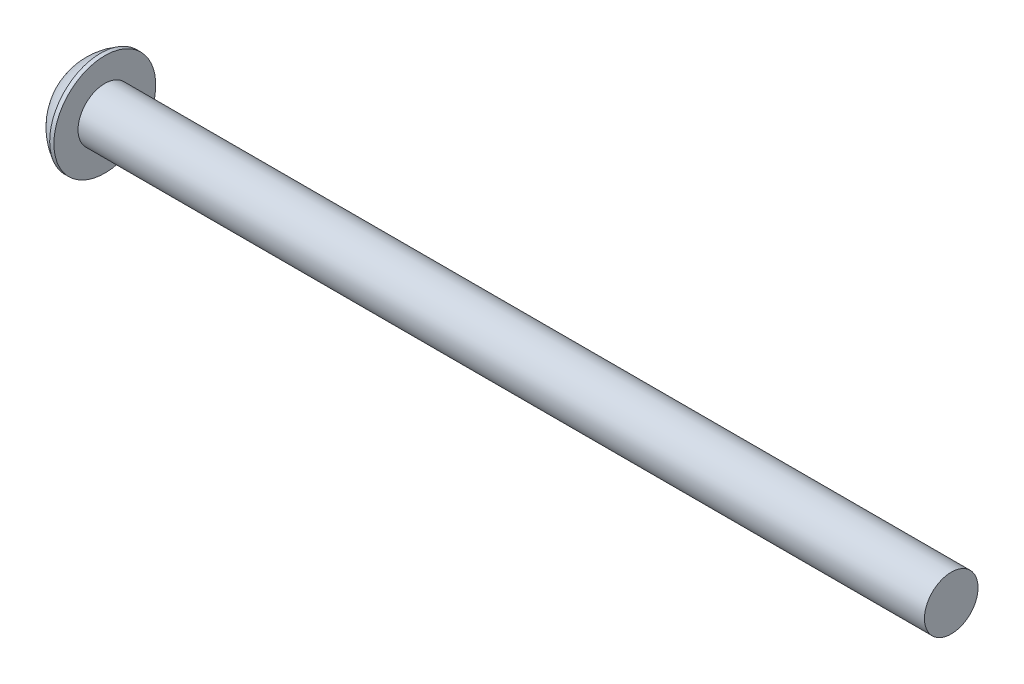
ISO-10303-21;
HEADER;
FILE_DESCRIPTION(('STEP AP214'),'2;1');
FILE_NAME('part.step','',(''),(''),'','','');
FILE_SCHEMA(('AUTOMOTIVE_DESIGN { 1 0 10303 214 1 1 1 1 }'));
ENDSEC;
DATA;
#1=APPLICATION_CONTEXT('core data for automotive mechanical design processes');
#2=APPLICATION_PROTOCOL_DEFINITION('international standard','automotive_design',2000,#1);
#3=PRODUCT_CONTEXT('',#1,'mechanical');
#4=PRODUCT('Part','Part','',(#3));
#5=PRODUCT_RELATED_PRODUCT_CATEGORY('part','',(#4));
#6=PRODUCT_DEFINITION_FORMATION('','',#4);
#7=PRODUCT_DEFINITION_CONTEXT('part definition',#1,'design');
#8=PRODUCT_DEFINITION('design','',#6,#7);
#9=PRODUCT_DEFINITION_SHAPE('','',#8);
#10=(LENGTH_UNIT() NAMED_UNIT(*) SI_UNIT(.MILLI.,.METRE.));
#11=(NAMED_UNIT(*) PLANE_ANGLE_UNIT() SI_UNIT($,.RADIAN.));
#12=(NAMED_UNIT(*) SI_UNIT($,.STERADIAN.) SOLID_ANGLE_UNIT());
#13=UNCERTAINTY_MEASURE_WITH_UNIT(LENGTH_MEASURE(1.E-05),#10,'distance_accuracy_value','');
#14=(GEOMETRIC_REPRESENTATION_CONTEXT(3) GLOBAL_UNCERTAINTY_ASSIGNED_CONTEXT((#13)) GLOBAL_UNIT_ASSIGNED_CONTEXT((#10,
#11,#12)) REPRESENTATION_CONTEXT('',''));
#15=CARTESIAN_POINT('',(0.,0.,0.));
#16=DIRECTION('',(0.,0.,1.));
#17=DIRECTION('',(1.,0.,0.));
#18=AXIS2_PLACEMENT_3D('',#15,#16,#17);
#19=CARTESIAN_POINT('',(-1.82880000000001,0.,0.));
#20=DIRECTION('',(-1.,0.,0.));
#21=DIRECTION('',(0.,0.,1.));
#22=AXIS2_PLACEMENT_3D('',#19,#20,#21);
#23=CONICAL_SURFACE('',#22,1.8288,0.785398163397446);
#24=CARTESIAN_POINT('',(-1.82880000000001,0.,0.));
#25=DIRECTION('',(-1.,0.,0.));
#26=DIRECTION('',(0.,0.,1.));
#27=AXIS2_PLACEMENT_3D('',#24,#25,#26);
#28=CIRCLE('',#27,1.8288);
#29=CARTESIAN_POINT('',(-1.82880000000001,-1.5800482210968,0.920845838894232));
#30=VERTEX_POINT('',#29);
#31=CARTESIAN_POINT('',(-1.82880000000001,-0.00745177890319596,1.82878481812136));
#32=VERTEX_POINT('',#31);
#33=EDGE_CURVE('E282',#30,#32,#28,.T.);
#34=ORIENTED_EDGE('',*,*,#33,.T.);
#35=CARTESIAN_POINT('',(-1.82900000000001,-0.00710296193273566,1.82898620769315));
#36=CARTESIAN_POINT('',(-1.79798176582111,-0.0612413968680569,1.79772936770974));
#37=CARTESIAN_POINT('',(-1.768804762154,-0.116280715119974,1.76595240250098));
#38=CARTESIAN_POINT('',(-1.71541731135211,-0.228486753173014,1.70117021622636));
#39=CARTESIAN_POINT('',(-1.6912359800132,-0.285663770827651,1.66815904969199));
#40=CARTESIAN_POINT('',(-1.64983313923053,-0.400953626097391,1.60159642071718));
#41=CARTESIAN_POINT('',(-1.63250927558265,-0.459038096623038,1.56806133602346));
#42=CARTESIAN_POINT('',(-1.60583796244815,-0.57646465769773,1.50026507937697));
#43=CARTESIAN_POINT('',(-1.59647107247955,-0.635803317985223,1.46600588788664));
#44=CARTESIAN_POINT('',(-1.58800887531627,-0.738427717920978,1.4067556629583));
#45=CARTESIAN_POINT('',(-1.58678086812113,-0.781586520417756,1.38183791671889));
#46=CARTESIAN_POINT('',(-1.58902398395721,-0.86782949219464,1.33204551374779));
#47=CARTESIAN_POINT('',(-1.59249673611106,-0.910913630416431,1.30717087494764));
#48=CARTESIAN_POINT('',(-1.60394206540771,-0.996659819496217,1.25766528960044));
#49=CARTESIAN_POINT('',(-1.61191838302761,-1.0393214894606,1.23303456296242));
#50=CARTESIAN_POINT('',(-1.63193840774461,-1.12392707655171,1.18418750448042));
#51=CARTESIAN_POINT('',(-1.6439838418413,-1.1658706809649,1.15997135318168));
#52=CARTESIAN_POINT('',(-1.67924043571692,-1.27185330769289,1.09878225511085));
#53=CARTESIAN_POINT('',(-1.70494165955475,-1.33527334252756,1.06216668092704));
#54=CARTESIAN_POINT('',(-1.74825503670668,-1.42856416830639,1.00830519755071));
#55=CARTESIAN_POINT('',(-1.76346130507454,-1.45931193774139,0.990552964590434));
#56=CARTESIAN_POINT('',(-1.79524996181871,-1.52025510962339,0.955367407899095));
#57=CARTESIAN_POINT('',(-1.8118317729839,-1.55045073733563,0.937933954111084));
#58=CARTESIAN_POINT('',(-1.82900000000027,-1.58039703806773,0.920644449322172));
#59=B_SPLINE_CURVE_WITH_KNOTS('',3,(#35,#36,#37,#38,#39,#40,#41,#42,#43,#44,#45,#46,#47,#48,#49,
#50,#51,#52,#53,#54,#55,#56,#57,#58),.UNSPECIFIED.,.F.,.F.,(4,2,2,2,2,2,2,2,2,2,2,4),(0.,
0.209500144466995,0.420188843332821,0.627602144749848,0.834507224341981,0.983847288144539,
1.13323912136536,1.28275521623455,1.43233484807212,1.66469982490852,1.78055165650198,
1.89635511741463),.UNSPECIFIED.);
#60=EDGE_CURVE('E246',#32,#30,#59,.T.);
#61=ORIENTED_EDGE('',*,*,#60,.T.);
#62=EDGE_LOOP('',(#34,#61));
#63=FACE_BOUND('',#62,.T.);
#64=ADVANCED_FACE('F53',(#63),#23,.F.);
#65=CARTESIAN_POINT('',(-1.82880000000001,-1.5875,-0.907938979227127));
#66=VERTEX_POINT('',#65);
#67=CARTESIAN_POINT('',(-1.82880000000001,-1.5875,0.907938979227127));
#68=VERTEX_POINT('',#67);
#69=EDGE_CURVE('E320',#66,#68,#28,.T.);
#70=ORIENTED_EDGE('',*,*,#69,.T.);
#71=CARTESIAN_POINT('',(-2.41884583359235,-1.5875,-1.82500929221937));
#72=CARTESIAN_POINT('',(-2.38531276542623,-1.5875,-1.78055818469936));
#73=CARTESIAN_POINT('',(-2.35210936835997,-1.5875,-1.73585907650942));
#74=CARTESIAN_POINT('',(-2.28649794756445,-1.5875,-1.64586427633954));
#75=CARTESIAN_POINT('',(-2.25409012601858,-1.5875,-1.600568437113));
#76=CARTESIAN_POINT('',(-2.15780190494498,-1.5875,-1.46297210215584));
#77=CARTESIAN_POINT('',(-2.09537319757193,-1.5875,-1.36963858857972));
#78=CARTESIAN_POINT('',(-1.97284516161749,-1.5875,-1.1739408617932));
#79=CARTESIAN_POINT('',(-1.91308014332863,-1.5875,-1.07136492019386));
#80=CARTESIAN_POINT('',(-1.80377603992626,-1.5875,-0.861093370178889));
#81=CARTESIAN_POINT('',(-1.75420248563308,-1.5875,-0.753416586787839));
#82=CARTESIAN_POINT('',(-1.69355473541147,-1.5875,-0.59176442890705));
#83=CARTESIAN_POINT('',(-1.67614346878425,-1.5875,-0.540176081947481));
#84=CARTESIAN_POINT('',(-1.64546298974417,-1.5875,-0.435756532214797));
#85=CARTESIAN_POINT('',(-1.63219406350996,-1.5875,-0.382925243842576));
#86=CARTESIAN_POINT('',(-1.61070764570342,-1.5875,-0.277216790300937));
#87=CARTESIAN_POINT('',(-1.60240378593419,-1.5875,-0.224357458354004));
#88=CARTESIAN_POINT('',(-1.59100915058537,-1.5875,-0.118076745851791));
#89=CARTESIAN_POINT('',(-1.58791748493136,-1.5875,-0.0646554628277625));
#90=CARTESIAN_POINT('',(-1.58717534074502,-1.5875,0.0403024254508758));
#91=CARTESIAN_POINT('',(-1.58933324549264,-1.5875,0.0918377424270171));
#92=CARTESIAN_POINT('',(-1.59854919060368,-1.5875,0.194465290551352));
#93=CARTESIAN_POINT('',(-1.60560770796995,-1.5875,0.245557478077194));
#94=CARTESIAN_POINT('',(-1.62435975757509,-1.5875,0.347793759019247));
#95=CARTESIAN_POINT('',(-1.63613206364932,-1.5875,0.398923183857681));
#96=CARTESIAN_POINT('',(-1.66368690090293,-1.5875,0.500065247928145));
#97=CARTESIAN_POINT('',(-1.67946909288466,-1.5875,0.55007798123241));
#98=CARTESIAN_POINT('',(-1.73513369416259,-1.5875,0.707672888264434));
#99=CARTESIAN_POINT('',(-1.78136125535134,-1.5875,0.813008430509164));
#100=CARTESIAN_POINT('',(-1.88413869504212,-1.5875,1.01872985181378));
#101=CARTESIAN_POINT('',(-1.94072568595621,-1.5875,1.11909623158763));
#102=CARTESIAN_POINT('',(-2.05746539148359,-1.5875,1.31090882483437));
#103=CARTESIAN_POINT('',(-2.11730100937777,-1.5875,1.40255044446812));
#104=CARTESIAN_POINT('',(-2.20979890181475,-1.5875,1.53756602680819));
#105=CARTESIAN_POINT('',(-2.24095734379018,-1.5875,1.58198845986807));
#106=CARTESIAN_POINT('',(-2.30409778175578,-1.5875,1.67022633905771));
#107=CARTESIAN_POINT('',(-2.33607954894282,-1.5875,1.71404194872823));
#108=CARTESIAN_POINT('',(-2.36840270150048,-1.5875,1.75760493469799));
#109=B_SPLINE_CURVE_WITH_KNOTS('',3,(#71,#72,#73,#74,#75,#76,#77,#78,#79,#80,#81,#82,#83,#84,
#85,#86,#87,#88,#89,#90,#91,#92,#93,#94,#95,#96,#97,#98,#99,#100,#101,#102,#103,#104,#105,#106,
#107,#108),.UNSPECIFIED.,.F.,.F.,(4,2,2,2,2,2,2,2,2,2,2,2,2,2,2,2,2,2,4),(0.,0.167038582206583,
0.33411918424497,0.670830460170841,1.0266880706705,1.38132155981881,1.54452529826255,
1.70774030934245,1.86802667313751,2.02828566242478,2.18278328824719,2.33729595425851,
2.49450635071892,2.65170345312208,2.99578906555957,3.34113237629954,3.66930816833921,
3.8320834275226,3.99481392942941),.UNSPECIFIED.);
#110=EDGE_CURVE('E256',#68,#66,#109,.F.);
#111=ORIENTED_EDGE('',*,*,#110,.T.);
#112=EDGE_LOOP('',(#70,#111));
#113=FACE_BOUND('',#112,.T.);
#114=ADVANCED_FACE('F343',(#113),#23,.F.);
#115=CARTESIAN_POINT('',(-1.82880000000001,-0.00745177890319589,-1.82878481812136));
#116=VERTEX_POINT('',#115);
#117=CARTESIAN_POINT('',(-1.82880000000001,-1.5800482210968,-0.920845838894232));
#118=VERTEX_POINT('',#117);
#119=EDGE_CURVE('E311',#116,#118,#28,.T.);
#120=ORIENTED_EDGE('',*,*,#119,.T.);
#121=CARTESIAN_POINT('',(-1.82900000000027,-1.58039703806773,-0.920644449322172));
#122=CARTESIAN_POINT('',(-1.79798176582135,-1.52625860313238,-0.9519012893056));
#123=CARTESIAN_POINT('',(-1.76880476215421,-1.47121928488044,-0.983678254514374));
#124=CARTESIAN_POINT('',(-1.71541731135227,-1.35901324682734,-1.04846044078903));
#125=CARTESIAN_POINT('',(-1.69123598001333,-1.30183622917267,-1.08147160732341));
#126=CARTESIAN_POINT('',(-1.64983313923061,-1.18654637390287,-1.14803423629827));
#127=CARTESIAN_POINT('',(-1.63250927558271,-1.12846190337719,-1.181569320992));
#128=CARTESIAN_POINT('',(-1.60583796244818,-1.01103534230243,-1.24936557763853));
#129=CARTESIAN_POINT('',(-1.59647107247956,-0.951696682014902,-1.28362476912888));
#130=CARTESIAN_POINT('',(-1.58800887531627,-0.849072282079111,-1.34287499405724));
#131=CARTESIAN_POINT('',(-1.58678086812113,-0.805913479582331,-1.36779274029665));
#132=CARTESIAN_POINT('',(-1.58902398395721,-0.719670507805444,-1.41758514326775));
#133=CARTESIAN_POINT('',(-1.59249673611105,-0.676586369583651,-1.44245978206791));
#134=CARTESIAN_POINT('',(-1.6039420654077,-0.590840180503862,-1.49196536741511));
#135=CARTESIAN_POINT('',(-1.6119183830276,-0.548178510539481,-1.51659609405312));
#136=CARTESIAN_POINT('',(-1.63193840774459,-0.463572923448363,-1.56544315253513));
#137=CARTESIAN_POINT('',(-1.64398384184128,-0.421629319035169,-1.58965930383387));
#138=CARTESIAN_POINT('',(-1.67924043571687,-0.315646692307251,-1.65084840190466));
#139=CARTESIAN_POINT('',(-1.70494165955467,-0.252226657472647,-1.68746397608843));
#140=CARTESIAN_POINT('',(-1.74825503670653,-0.158935831693913,-1.7413254594647));
#141=CARTESIAN_POINT('',(-1.76346130507437,-0.128188062258947,-1.75907769242496));
#142=CARTESIAN_POINT('',(-1.79524996181849,-0.0672448903770153,-1.79426324911627));
#143=CARTESIAN_POINT('',(-1.81183177298366,-0.0370492626648079,-1.81169670290426));
#144=CARTESIAN_POINT('',(-1.82900000000001,-0.00710296193273622,-1.82898620769315));
#145=B_SPLINE_CURVE_WITH_KNOTS('',3,(#121,#122,#123,#124,#125,#126,#127,#128,#129,#130,#131,
#132,#133,#134,#135,#136,#137,#138,#139,#140,#141,#142,#143,#144),.UNSPECIFIED.,.F.,.F.,(4,2,2,
2,2,2,2,2,2,2,2,4),(0.,0.209500144467116,0.420188843333066,0.627602144750217,0.834507224342473,
0.983847288145037,1.13323912136586,1.28275521623506,1.43233484807263,1.66469982490877,
1.78055165650211,1.89635511741463),.UNSPECIFIED.);
#146=EDGE_CURVE('E317',#118,#116,#145,.T.);
#147=ORIENTED_EDGE('',*,*,#146,.T.);
#148=EDGE_LOOP('',(#120,#147));
#149=FACE_BOUND('',#148,.T.);
#150=ADVANCED_FACE('F316',(#149),#23,.F.);
#151=CARTESIAN_POINT('',(-1.82880000000001,1.5800482210968,-0.920845838894233));
#152=VERTEX_POINT('',#151);
#153=CARTESIAN_POINT('',(-1.82880000000001,0.00745177890319661,-1.82878481812136));
#154=VERTEX_POINT('',#153);
#155=EDGE_CURVE('E319',#152,#154,#28,.T.);
#156=ORIENTED_EDGE('',*,*,#155,.T.);
#157=CARTESIAN_POINT('',(-1.82900000000001,0.0071029619327367,-1.82898620769315));
#158=CARTESIAN_POINT('',(-1.79798176582111,0.0612413968680578,-1.79772936770974));
#159=CARTESIAN_POINT('',(-1.768804762154,0.116280715119975,-1.76595240250098));
#160=CARTESIAN_POINT('',(-1.71541731135211,0.228486753173015,-1.70117021622636));
#161=CARTESIAN_POINT('',(-1.6912359800132,0.285663770827651,-1.66815904969199));
#162=CARTESIAN_POINT('',(-1.64983313923053,0.400953626097391,-1.60159642071718));
#163=CARTESIAN_POINT('',(-1.63250927558265,0.459038096623038,-1.56806133602346));
#164=CARTESIAN_POINT('',(-1.60583796244815,0.576464657697731,-1.50026507937697));
#165=CARTESIAN_POINT('',(-1.59647107247955,0.635803317985223,-1.46600588788664));
#166=CARTESIAN_POINT('',(-1.58800887531627,0.738427717920978,-1.4067556629583));
#167=CARTESIAN_POINT('',(-1.58678086812113,0.781586520417756,-1.38183791671889));
#168=CARTESIAN_POINT('',(-1.58902398395721,0.86782949219464,-1.33204551374779));
#169=CARTESIAN_POINT('',(-1.59249673611106,0.910913630416431,-1.30717087494764));
#170=CARTESIAN_POINT('',(-1.60394206540771,0.996659819496218,-1.25766528960044));
#171=CARTESIAN_POINT('',(-1.61191838302761,1.0393214894606,-1.23303456296242));
#172=CARTESIAN_POINT('',(-1.63193840774461,1.12392707655171,-1.18418750448042));
#173=CARTESIAN_POINT('',(-1.6439838418413,1.1658706809649,-1.15997135318168));
#174=CARTESIAN_POINT('',(-1.67924043571692,1.27185330769289,-1.09878225511086));
#175=CARTESIAN_POINT('',(-1.70494165955475,1.33527334252756,-1.06216668092704));
#176=CARTESIAN_POINT('',(-1.74825503670668,1.42856416830639,-1.00830519755071));
#177=CARTESIAN_POINT('',(-1.76346130507454,1.45931193774139,-0.990552964590434));
#178=CARTESIAN_POINT('',(-1.79524996181871,1.52025510962339,-0.955367407899095));
#179=CARTESIAN_POINT('',(-1.8118317729839,1.55045073733563,-0.937933954111085));
#180=CARTESIAN_POINT('',(-1.82900000000027,1.58039703806773,-0.920644449322172));
#181=B_SPLINE_CURVE_WITH_KNOTS('',3,(#157,#158,#159,#160,#161,#162,#163,#164,#165,#166,#167,
#168,#169,#170,#171,#172,#173,#174,#175,#176,#177,#178,#179,#180),.UNSPECIFIED.,.F.,.F.,(4,2,2,
2,2,2,2,2,2,2,2,4),(0.,0.209500144466994,0.420188843332819,0.627602144749847,0.834507224341979,
0.983847288144538,1.13323912136536,1.28275521623455,1.43233484807212,1.66469982490852,
1.78055165650198,1.89635511741463),.UNSPECIFIED.);
#182=EDGE_CURVE('E359',#154,#152,#181,.T.);
#183=ORIENTED_EDGE('',*,*,#182,.T.);
#184=EDGE_LOOP('',(#156,#183));
#185=FACE_BOUND('',#184,.T.);
#186=ADVANCED_FACE('F340',(#185),#23,.F.);
#187=CARTESIAN_POINT('',(-1.82880000000001,1.5875,0.907938979227128));
#188=VERTEX_POINT('',#187);
#189=CARTESIAN_POINT('',(-1.82880000000001,1.5875,-0.907938979227128));
#190=VERTEX_POINT('',#189);
#191=EDGE_CURVE('E287',#188,#190,#28,.T.);
#192=ORIENTED_EDGE('',*,*,#191,.T.);
#193=CARTESIAN_POINT('',(-2.41884583359235,1.5875,-1.82500929221937));
#194=CARTESIAN_POINT('',(-2.38531276542623,1.5875,-1.78055818469936));
#195=CARTESIAN_POINT('',(-2.35210936835997,1.5875,-1.73585907650943));
#196=CARTESIAN_POINT('',(-2.28649794756445,1.5875,-1.64586427633954));
#197=CARTESIAN_POINT('',(-2.25409012601858,1.5875,-1.600568437113));
#198=CARTESIAN_POINT('',(-2.15780190494498,1.5875,-1.46297210215584));
#199=CARTESIAN_POINT('',(-2.09537319757193,1.5875,-1.36963858857972));
#200=CARTESIAN_POINT('',(-1.97284516161749,1.5875,-1.1739408617932));
#201=CARTESIAN_POINT('',(-1.91308014332863,1.5875,-1.07136492019386));
#202=CARTESIAN_POINT('',(-1.80377603992626,1.5875,-0.861093370178889));
#203=CARTESIAN_POINT('',(-1.75420248563308,1.5875,-0.75341658678784));
#204=CARTESIAN_POINT('',(-1.69355473541147,1.5875,-0.591764428907051));
#205=CARTESIAN_POINT('',(-1.67614346878425,1.5875,-0.540176081947482));
#206=CARTESIAN_POINT('',(-1.64546298974417,1.5875,-0.435756532214797));
#207=CARTESIAN_POINT('',(-1.63219406350996,1.5875,-0.382925243842576));
#208=CARTESIAN_POINT('',(-1.61070764570342,1.5875,-0.277216790300937));
#209=CARTESIAN_POINT('',(-1.60240378593419,1.5875,-0.224357458354004));
#210=CARTESIAN_POINT('',(-1.59100915058537,1.5875,-0.118076745851792));
#211=CARTESIAN_POINT('',(-1.58791748493136,1.5875,-0.064655462827763));
#212=CARTESIAN_POINT('',(-1.58717534074502,1.5875,0.0403024254508755));
#213=CARTESIAN_POINT('',(-1.58933324549264,1.5875,0.091837742427017));
#214=CARTESIAN_POINT('',(-1.59854919060368,1.5875,0.194465290551352));
#215=CARTESIAN_POINT('',(-1.60560770796995,1.5875,0.245557478077194));
#216=CARTESIAN_POINT('',(-1.62435975757509,1.5875,0.347793759019247));
#217=CARTESIAN_POINT('',(-1.63613206364932,1.5875,0.398923183857681));
#218=CARTESIAN_POINT('',(-1.66368690090293,1.5875,0.500065247928145));
#219=CARTESIAN_POINT('',(-1.67946909288466,1.5875,0.55007798123241));
#220=CARTESIAN_POINT('',(-1.73513369416259,1.5875,0.707672888264434));
#221=CARTESIAN_POINT('',(-1.78136125535134,1.5875,0.813008430509164));
#222=CARTESIAN_POINT('',(-1.88413869504212,1.5875,1.01872985181378));
#223=CARTESIAN_POINT('',(-1.94072568595621,1.5875,1.11909623158763));
#224=CARTESIAN_POINT('',(-2.05746539148359,1.5875,1.31090882483437));
#225=CARTESIAN_POINT('',(-2.11730100937777,1.5875,1.40255044446812));
#226=CARTESIAN_POINT('',(-2.20979890181476,1.5875,1.53756602680819));
#227=CARTESIAN_POINT('',(-2.24095734379018,1.5875,1.58198845986808));
#228=CARTESIAN_POINT('',(-2.30409778175578,1.5875,1.67022633905771));
#229=CARTESIAN_POINT('',(-2.33607954894282,1.5875,1.71404194872824));
#230=CARTESIAN_POINT('',(-2.36840270150048,1.5875,1.75760493469799));
#231=B_SPLINE_CURVE_WITH_KNOTS('',3,(#193,#194,#195,#196,#197,#198,#199,#200,#201,#202,#203,
#204,#205,#206,#207,#208,#209,#210,#211,#212,#213,#214,#215,#216,#217,#218,#219,#220,#221,#222,
#223,#224,#225,#226,#227,#228,#229,#230),.UNSPECIFIED.,.F.,.F.,(4,2,2,2,2,2,2,2,2,2,2,2,2,2,2,2,
2,2,4),(0.,0.167038582206584,0.334119184244971,0.670830460170842,1.0266880706705,
1.38132155981881,1.54452529826255,1.70774030934245,1.86802667313751,2.02828566242479,
2.18278328824719,2.33729595425851,2.49450635071892,2.65170345312209,2.99578906555957,
3.34113237629955,3.66930816833922,3.8320834275226,3.99481392942941),.UNSPECIFIED.);
#232=EDGE_CURVE('E226',#190,#188,#231,.T.);
#233=ORIENTED_EDGE('',*,*,#232,.T.);
#234=EDGE_LOOP('',(#192,#233));
#235=FACE_BOUND('',#234,.T.);
#236=ADVANCED_FACE('F334',(#235),#23,.F.);
#237=CARTESIAN_POINT('',(-1.82880000000001,0.00745177890319555,1.82878481812136));
#238=VERTEX_POINT('',#237);
#239=CARTESIAN_POINT('',(-1.82880000000001,1.58004822109681,0.920845838894231));
#240=VERTEX_POINT('',#239);
#241=EDGE_CURVE('E283',#238,#240,#28,.T.);
#242=ORIENTED_EDGE('',*,*,#241,.T.);
#243=CARTESIAN_POINT('',(-1.82900000000027,1.58039703806773,0.920644449322171));
#244=CARTESIAN_POINT('',(-1.79798176582135,1.52625860313238,0.951901289305599));
#245=CARTESIAN_POINT('',(-1.76880476215421,1.47121928488044,0.983678254514373));
#246=CARTESIAN_POINT('',(-1.71541731135226,1.35901324682734,1.04846044078903));
#247=CARTESIAN_POINT('',(-1.69123598001333,1.30183622917267,1.08147160732341));
#248=CARTESIAN_POINT('',(-1.64983313923061,1.18654637390287,1.14803423629827));
#249=CARTESIAN_POINT('',(-1.63250927558271,1.12846190337719,1.181569320992));
#250=CARTESIAN_POINT('',(-1.60583796244818,1.01103534230243,1.24936557763853));
#251=CARTESIAN_POINT('',(-1.59647107247956,0.951696682014902,1.28362476912888));
#252=CARTESIAN_POINT('',(-1.58800887531627,0.849072282079111,1.34287499405724));
#253=CARTESIAN_POINT('',(-1.58678086812113,0.805913479582331,1.36779274029665));
#254=CARTESIAN_POINT('',(-1.58902398395721,0.719670507805444,1.41758514326775));
#255=CARTESIAN_POINT('',(-1.59249673611105,0.676586369583651,1.44245978206791));
#256=CARTESIAN_POINT('',(-1.6039420654077,0.590840180503862,1.49196536741511));
#257=CARTESIAN_POINT('',(-1.6119183830276,0.54817851053948,1.51659609405312));
#258=CARTESIAN_POINT('',(-1.63193840774459,0.463572923448362,1.56544315253513));
#259=CARTESIAN_POINT('',(-1.64398384184128,0.421629319035169,1.58965930383387));
#260=CARTESIAN_POINT('',(-1.67924043571687,0.315646692307251,1.65084840190466));
#261=CARTESIAN_POINT('',(-1.70494165955467,0.252226657472647,1.68746397608843));
#262=CARTESIAN_POINT('',(-1.74825503670654,0.158935831693913,1.7413254594647));
#263=CARTESIAN_POINT('',(-1.76346130507437,0.128188062258947,1.75907769242496));
#264=CARTESIAN_POINT('',(-1.79524996181849,0.0672448903770154,1.79426324911627));
#265=CARTESIAN_POINT('',(-1.81183177298366,0.037049262664808,1.81169670290426));
#266=CARTESIAN_POINT('',(-1.82900000000001,0.00710296193273642,1.82898620769315));
#267=B_SPLINE_CURVE_WITH_KNOTS('',3,(#243,#244,#245,#246,#247,#248,#249,#250,#251,#252,#253,
#254,#255,#256,#257,#258,#259,#260,#261,#262,#263,#264,#265,#266),.UNSPECIFIED.,.F.,.F.,(4,2,2,
2,2,2,2,2,2,2,2,4),(0.,0.209500144467116,0.420188843333066,0.627602144750217,0.834507224342473,
0.983847288145037,1.13323912136587,1.28275521623506,1.43233484807263,1.66469982490877,
1.78055165650211,1.89635511741463),.UNSPECIFIED.);
#268=EDGE_CURVE('E203',#240,#238,#267,.T.);
#269=ORIENTED_EDGE('',*,*,#268,.T.);
#270=EDGE_LOOP('',(#242,#269));
#271=FACE_BOUND('',#270,.T.);
#272=ADVANCED_FACE('F55',(#271),#23,.F.);
#273=CARTESIAN_POINT('',(-1.82880000000001,2.41299999999999,0.));
#274=DIRECTION('',(1.,0.,0.));
#275=DIRECTION('',(0.,0.,-1.));
#276=AXIS2_PLACEMENT_3D('',#273,#274,#275);
#277=PLANE('',#276);
#278=ORIENTED_EDGE('',*,*,#33,.F.);
#279=DIRECTION('',(0.,0.866025403784438,0.5));
#280=VECTOR('',#279,1.);
#281=CARTESIAN_POINT('',(-1.82880000000001,-1.5875,0.916543552338531));
#282=LINE('',#281,#280);
#283=CARTESIAN_POINT('',(-1.82880000000001,-1.5875,0.916543552338531));
#284=VERTEX_POINT('',#283);
#285=EDGE_CURVE('E186',#284,#30,#282,.T.);
#286=ORIENTED_EDGE('',*,*,#285,.F.);
#287=DIRECTION('',(0.,0.,-1.));
#288=VECTOR('',#287,1.);
#289=CARTESIAN_POINT('',(-1.82880000000001,-1.5875,0.));
#290=LINE('',#289,#288);
#291=EDGE_CURVE('E11',#284,#68,#290,.T.);
#292=ORIENTED_EDGE('',*,*,#291,.T.);
#293=ORIENTED_EDGE('',*,*,#69,.F.);
#294=DIRECTION('',(0.,0.,1.));
#295=VECTOR('',#294,1.);
#296=CARTESIAN_POINT('',(-1.82880000000001,-1.5875,-0.91654355233853));
#297=LINE('',#296,#295);
#298=CARTESIAN_POINT('',(-1.82880000000001,-1.5875,-0.91654355233853));
#299=VERTEX_POINT('',#298);
#300=EDGE_CURVE('E169',#299,#66,#297,.T.);
#301=ORIENTED_EDGE('',*,*,#300,.F.);
#302=DIRECTION('',(0.,0.866025403784439,-0.5));
#303=VECTOR('',#302,1.);
#304=CARTESIAN_POINT('',(-1.82880000000001,1.01599999999999,-2.41967497817372));
#305=LINE('',#304,#303);
#306=EDGE_CURVE('E63',#299,#118,#305,.T.);
#307=ORIENTED_EDGE('',*,*,#306,.T.);
#308=ORIENTED_EDGE('',*,*,#119,.F.);
#309=DIRECTION('',(0.,-0.866025403784438,0.5));
#310=VECTOR('',#309,1.);
#311=CARTESIAN_POINT('',(-1.82880000000001,0.,-1.83308710467706));
#312=LINE('',#311,#310);
#313=CARTESIAN_POINT('',(-1.82880000000001,0.,-1.83308710467706));
#314=VERTEX_POINT('',#313);
#315=EDGE_CURVE('E172',#314,#116,#312,.T.);
#316=ORIENTED_EDGE('',*,*,#315,.F.);
#317=DIRECTION('',(0.,0.866025403784439,0.5));
#318=VECTOR('',#317,1.);
#319=CARTESIAN_POINT('',(-1.82880000000001,2.60349999999999,-0.329955678841874));
#320=LINE('',#319,#318);
#321=EDGE_CURVE('E298',#314,#154,#320,.T.);
#322=ORIENTED_EDGE('',*,*,#321,.T.);
#323=ORIENTED_EDGE('',*,*,#155,.F.);
#324=DIRECTION('',(0.,-0.866025403784438,-0.5));
#325=VECTOR('',#324,1.);
#326=CARTESIAN_POINT('',(-1.82880000000001,1.5875,-0.916543552338531));
#327=LINE('',#326,#325);
#328=CARTESIAN_POINT('',(-1.82880000000001,1.5875,-0.916543552338531));
#329=VERTEX_POINT('',#328);
#330=EDGE_CURVE('E195',#329,#152,#327,.T.);
#331=ORIENTED_EDGE('',*,*,#330,.F.);
#332=DIRECTION('',(0.,0.,1.));
#333=VECTOR('',#332,1.);
#334=CARTESIAN_POINT('',(-1.82880000000001,1.5875,0.));
#335=LINE('',#334,#333);
#336=EDGE_CURVE('E292',#329,#190,#335,.T.);
#337=ORIENTED_EDGE('',*,*,#336,.T.);
#338=ORIENTED_EDGE('',*,*,#191,.F.);
#339=DIRECTION('',(0.,0.,-1.));
#340=VECTOR('',#339,1.);
#341=CARTESIAN_POINT('',(-1.82880000000001,1.5875,0.91654355233853));
#342=LINE('',#341,#340);
#343=CARTESIAN_POINT('',(-1.82880000000001,1.5875,0.91654355233853));
#344=VERTEX_POINT('',#343);
#345=EDGE_CURVE('E192',#344,#188,#342,.T.);
#346=ORIENTED_EDGE('',*,*,#345,.F.);
#347=DIRECTION('',(0.,-0.866025403784438,0.5));
#348=VECTOR('',#347,1.);
#349=CARTESIAN_POINT('',(-1.82880000000001,2.60349999999999,0.329955678841873));
#350=LINE('',#349,#348);
#351=EDGE_CURVE('E288',#344,#240,#350,.T.);
#352=ORIENTED_EDGE('',*,*,#351,.T.);
#353=ORIENTED_EDGE('',*,*,#241,.F.);
#354=DIRECTION('',(0.,0.866025403784438,-0.5));
#355=VECTOR('',#354,1.);
#356=CARTESIAN_POINT('',(-1.82880000000001,0.,1.83308710467706));
#357=LINE('',#356,#355);
#358=CARTESIAN_POINT('',(-1.82880000000001,0.,1.83308710467706));
#359=VERTEX_POINT('',#358);
#360=EDGE_CURVE('E189',#359,#238,#357,.T.);
#361=ORIENTED_EDGE('',*,*,#360,.F.);
#362=DIRECTION('',(0.,-0.866025403784439,-0.5));
#363=VECTOR('',#362,1.);
#364=CARTESIAN_POINT('',(-1.82880000000001,1.01599999999999,2.41967497817372));
#365=LINE('',#364,#363);
#366=EDGE_CURVE('E149',#359,#32,#365,.T.);
#367=ORIENTED_EDGE('',*,*,#366,.T.);
#368=EDGE_LOOP('',(#278,#286,#292,#293,#301,#307,#308,#316,#322,#323,#331,#337,#338,#346,#352,
#353,#361,#367));
#369=FACE_BOUND('',#368,.T.);
#370=CARTESIAN_POINT('',(-1.82880000000001,0.,0.));
#371=DIRECTION('',(-1.,0.,0.));
#372=DIRECTION('',(0.,0.,1.));
#373=AXIS2_PLACEMENT_3D('',#370,#371,#372);
#374=CIRCLE('',#373,2.41299999999999);
#375=CARTESIAN_POINT('',(-1.82880000000001,0.,2.41299999999999));
#376=VERTEX_POINT('',#375);
#377=EDGE_CURVE('E278',#376,#376,#374,.T.);
#378=ORIENTED_EDGE('',*,*,#377,.T.);
#379=EDGE_LOOP('',(#378));
#380=FACE_BOUND('',#379,.T.);
#381=ADVANCED_FACE('F308',(#369,#380),#277,.F.);
#382=CARTESIAN_POINT('',(2.75154317616326,0.,0.));
#383=DIRECTION('',(-1.,0.,0.));
#384=DIRECTION('',(0.,0.,1.));
#385=AXIS2_PLACEMENT_3D('',#382,#383,#384);
#386=DEGENERATE_TOROIDAL_SURFACE('',#385,0.00969167426947537,5.1816,.F.);
#387=ORIENTED_EDGE('',*,*,#377,.F.);
#388=EDGE_LOOP('',(#387));
#389=FACE_BOUND('',#388,.T.);
#390=CARTESIAN_POINT('',(0.355599999999993,0.,0.));
#391=DIRECTION('',(-1.,0.,0.));
#392=DIRECTION('',(0.,0.,1.));
#393=AXIS2_PLACEMENT_3D('',#390,#391,#392);
#394=CIRCLE('',#393,4.5847);
#395=CARTESIAN_POINT('',(0.355599999999993,0.,4.5847));
#396=VERTEX_POINT('',#395);
#397=EDGE_CURVE('E274',#396,#396,#394,.T.);
#398=ORIENTED_EDGE('',*,*,#397,.T.);
#399=EDGE_LOOP('',(#398));
#400=FACE_BOUND('',#399,.T.);
#401=ADVANCED_FACE('F339',(#389,#400),#386,.F.);
#402=CARTESIAN_POINT('',(0.,0.,0.));
#403=DIRECTION('',(-1.,0.,0.));
#404=DIRECTION('',(0.,0.,1.));
#405=AXIS2_PLACEMENT_3D('',#402,#403,#404);
#406=CYLINDRICAL_SURFACE('',#405,4.5847);
#407=ORIENTED_EDGE('',*,*,#397,.F.);
#408=EDGE_LOOP('',(#407));
#409=FACE_BOUND('',#408,.T.);
#410=CARTESIAN_POINT('',(0.736599999999993,0.,0.));
#411=DIRECTION('',(-1.,0.,0.));
#412=DIRECTION('',(0.,0.,1.));
#413=AXIS2_PLACEMENT_3D('',#410,#411,#412);
#414=CIRCLE('',#413,4.5847);
#415=CARTESIAN_POINT('',(0.736599999999993,0.,4.5847));
#416=VERTEX_POINT('',#415);
#417=EDGE_CURVE('E270',#416,#416,#414,.T.);
#418=ORIENTED_EDGE('',*,*,#417,.T.);
#419=EDGE_LOOP('',(#418));
#420=FACE_BOUND('',#419,.T.);
#421=ADVANCED_FACE('F445',(#409,#420),#406,.T.);
#422=CARTESIAN_POINT('',(0.736599999999992,2.41299999999999,0.));
#423=DIRECTION('',(-1.,0.,0.));
#424=DIRECTION('',(0.,0.,1.));
#425=AXIS2_PLACEMENT_3D('',#422,#423,#424);
#426=PLANE('',#425);
#427=ORIENTED_EDGE('',*,*,#417,.F.);
#428=EDGE_LOOP('',(#427));
#429=FACE_BOUND('',#428,.T.);
#430=CARTESIAN_POINT('',(0.73659999999999,0.,0.));
#431=DIRECTION('',(-1.,0.,0.));
#432=DIRECTION('',(0.,0.,1.));
#433=AXIS2_PLACEMENT_3D('',#430,#431,#432);
#434=CIRCLE('',#433,2.41299999999999);
#435=CARTESIAN_POINT('',(0.73659999999999,0.,2.41299999999999));
#436=VERTEX_POINT('',#435);
#437=EDGE_CURVE('E266',#436,#436,#434,.T.);
#438=ORIENTED_EDGE('',*,*,#437,.T.);
#439=EDGE_LOOP('',(#438));
#440=FACE_BOUND('',#439,.T.);
#441=ADVANCED_FACE('F455',(#429,#440),#426,.F.);
#442=CARTESIAN_POINT('',(0.,0.,0.));
#443=DIRECTION('',(-1.,0.,0.));
#444=DIRECTION('',(0.,0.,1.));
#445=AXIS2_PLACEMENT_3D('',#442,#443,#444);
#446=CYLINDRICAL_SURFACE('',#445,2.413);
#447=ORIENTED_EDGE('',*,*,#437,.F.);
#448=EDGE_LOOP('',(#447));
#449=FACE_BOUND('',#448,.T.);
#450=CARTESIAN_POINT('',(76.9366,0.,0.));
#451=DIRECTION('',(-1.,0.,0.));
#452=DIRECTION('',(0.,0.,1.));
#453=AXIS2_PLACEMENT_3D('',#450,#451,#452);
#454=CIRCLE('',#453,2.41300000000001);
#455=CARTESIAN_POINT('',(76.9366,0.,2.41300000000001));
#456=VERTEX_POINT('',#455);
#457=EDGE_CURVE('E255',#456,#456,#454,.T.);
#458=ORIENTED_EDGE('',*,*,#457,.T.);
#459=EDGE_LOOP('',(#458));
#460=FACE_BOUND('',#459,.T.);
#461=ADVANCED_FACE('F465',(#449,#460),#446,.T.);
#462=CARTESIAN_POINT('',(76.9366,0.,0.));
#463=DIRECTION('',(-1.,0.,0.));
#464=DIRECTION('',(0.,0.,1.));
#465=AXIS2_PLACEMENT_3D('',#462,#463,#464);
#466=PLANE('',#465);
#467=ORIENTED_EDGE('',*,*,#457,.F.);
#468=EDGE_LOOP('',(#467));
#469=FACE_BOUND('',#468,.T.);
#470=ADVANCED_FACE('F243',(#469),#466,.F.);
#471=CARTESIAN_POINT('',(0.,-1.5875,0.916543552338531));
#472=DIRECTION('',(0.,-0.5,0.866025403784439));
#473=DIRECTION('',(0.,-0.866025403784439,-0.5));
#474=AXIS2_PLACEMENT_3D('',#471,#472,#473);
#475=PLANE('',#474);
#476=ORIENTED_EDGE('',*,*,#366,.F.);
#477=DIRECTION('',(-1.,0.,0.));
#478=VECTOR('',#477,1.);
#479=CARTESIAN_POINT('',(0.,0.,1.83308710467706));
#480=LINE('',#479,#478);
#481=CARTESIAN_POINT('',(0.,0.,1.83308710467706));
#482=VERTEX_POINT('',#481);
#483=EDGE_CURVE('E70',#482,#359,#480,.T.);
#484=ORIENTED_EDGE('',*,*,#483,.F.);
#485=DIRECTION('',(0.,0.866025403784438,0.5));
#486=VECTOR('',#485,1.);
#487=CARTESIAN_POINT('',(0.,-1.5875,0.916543552338531));
#488=LINE('',#487,#486);
#489=CARTESIAN_POINT('',(0.,-1.5875,0.916543552338531));
#490=VERTEX_POINT('',#489);
#491=EDGE_CURVE('E146',#490,#482,#488,.T.);
#492=ORIENTED_EDGE('',*,*,#491,.F.);
#493=DIRECTION('',(-1.,0.,0.));
#494=VECTOR('',#493,1.);
#495=CARTESIAN_POINT('',(0.,-1.5875,0.916543552338531));
#496=LINE('',#495,#494);
#497=EDGE_CURVE('E200',#490,#284,#496,.T.);
#498=ORIENTED_EDGE('',*,*,#497,.T.);
#499=ORIENTED_EDGE('',*,*,#285,.T.);
#500=ORIENTED_EDGE('',*,*,#60,.F.);
#501=EDGE_LOOP('',(#476,#484,#492,#498,#499,#500));
#502=FACE_BOUND('',#501,.T.);
#503=ADVANCED_FACE('F143',(#502),#475,.F.);
#504=CARTESIAN_POINT('',(0.,-1.5875,-0.91654355233853));
#505=DIRECTION('',(0.,-1.,0.));
#506=DIRECTION('',(0.,0.,-1.));
#507=AXIS2_PLACEMENT_3D('',#504,#505,#506);
#508=PLANE('',#507);
#509=ORIENTED_EDGE('',*,*,#291,.F.);
#510=ORIENTED_EDGE('',*,*,#497,.F.);
#511=DIRECTION('',(0.,0.,1.));
#512=VECTOR('',#511,1.);
#513=CARTESIAN_POINT('',(0.,-1.5875,-0.91654355233853));
#514=LINE('',#513,#512);
#515=CARTESIAN_POINT('',(0.,-1.5875,-0.91654355233853));
#516=VERTEX_POINT('',#515);
#517=EDGE_CURVE('E153',#516,#490,#514,.T.);
#518=ORIENTED_EDGE('',*,*,#517,.F.);
#519=DIRECTION('',(-1.,0.,0.));
#520=VECTOR('',#519,1.);
#521=CARTESIAN_POINT('',(0.,-1.5875,-0.91654355233853));
#522=LINE('',#521,#520);
#523=EDGE_CURVE('E204',#516,#299,#522,.T.);
#524=ORIENTED_EDGE('',*,*,#523,.T.);
#525=ORIENTED_EDGE('',*,*,#300,.T.);
#526=ORIENTED_EDGE('',*,*,#110,.F.);
#527=EDGE_LOOP('',(#509,#510,#518,#524,#525,#526));
#528=FACE_BOUND('',#527,.T.);
#529=ADVANCED_FACE('F242',(#528),#508,.F.);
#530=CARTESIAN_POINT('',(0.,0.,-1.83308710467706));
#531=DIRECTION('',(0.,-0.5,-0.866025403784438));
#532=DIRECTION('',(0.,0.866025403784439,-0.5));
#533=AXIS2_PLACEMENT_3D('',#530,#531,#532);
#534=PLANE('',#533);
#535=ORIENTED_EDGE('',*,*,#306,.F.);
#536=ORIENTED_EDGE('',*,*,#523,.F.);
#537=DIRECTION('',(0.,-0.866025403784438,0.5));
#538=VECTOR('',#537,1.);
#539=CARTESIAN_POINT('',(0.,0.,-1.83308710467706));
#540=LINE('',#539,#538);
#541=CARTESIAN_POINT('',(0.,0.,-1.83308710467706));
#542=VERTEX_POINT('',#541);
#543=EDGE_CURVE('E181',#542,#516,#540,.T.);
#544=ORIENTED_EDGE('',*,*,#543,.F.);
#545=DIRECTION('',(-1.,0.,0.));
#546=VECTOR('',#545,1.);
#547=CARTESIAN_POINT('',(0.,0.,-1.83308710467706));
#548=LINE('',#547,#546);
#549=EDGE_CURVE('E208',#542,#314,#548,.T.);
#550=ORIENTED_EDGE('',*,*,#549,.T.);
#551=ORIENTED_EDGE('',*,*,#315,.T.);
#552=ORIENTED_EDGE('',*,*,#146,.F.);
#553=EDGE_LOOP('',(#535,#536,#544,#550,#551,#552));
#554=FACE_BOUND('',#553,.T.);
#555=ADVANCED_FACE('F365',(#554),#534,.F.);
#556=CARTESIAN_POINT('',(0.,1.5875,-0.916543552338531));
#557=DIRECTION('',(0.,0.5,-0.866025403784438));
#558=DIRECTION('',(0.,0.866025403784439,0.5));
#559=AXIS2_PLACEMENT_3D('',#556,#557,#558);
#560=PLANE('',#559);
#561=ORIENTED_EDGE('',*,*,#321,.F.);
#562=ORIENTED_EDGE('',*,*,#549,.F.);
#563=DIRECTION('',(0.,-0.866025403784438,-0.5));
#564=VECTOR('',#563,1.);
#565=CARTESIAN_POINT('',(0.,1.5875,-0.916543552338531));
#566=LINE('',#565,#564);
#567=CARTESIAN_POINT('',(0.,1.5875,-0.916543552338531));
#568=VERTEX_POINT('',#567);
#569=EDGE_CURVE('E177',#568,#542,#566,.T.);
#570=ORIENTED_EDGE('',*,*,#569,.F.);
#571=DIRECTION('',(-1.,0.,0.));
#572=VECTOR('',#571,1.);
#573=CARTESIAN_POINT('',(0.,1.5875,-0.916543552338531));
#574=LINE('',#573,#572);
#575=EDGE_CURVE('E212',#568,#329,#574,.T.);
#576=ORIENTED_EDGE('',*,*,#575,.T.);
#577=ORIENTED_EDGE('',*,*,#330,.T.);
#578=ORIENTED_EDGE('',*,*,#182,.F.);
#579=EDGE_LOOP('',(#561,#562,#570,#576,#577,#578));
#580=FACE_BOUND('',#579,.T.);
#581=ADVANCED_FACE('F362',(#580),#560,.F.);
#582=CARTESIAN_POINT('',(0.,1.5875,0.91654355233853));
#583=DIRECTION('',(0.,1.,0.));
#584=DIRECTION('',(0.,0.,1.));
#585=AXIS2_PLACEMENT_3D('',#582,#583,#584);
#586=PLANE('',#585);
#587=ORIENTED_EDGE('',*,*,#336,.F.);
#588=ORIENTED_EDGE('',*,*,#575,.F.);
#589=DIRECTION('',(0.,0.,-1.));
#590=VECTOR('',#589,1.);
#591=CARTESIAN_POINT('',(0.,1.5875,0.91654355233853));
#592=LINE('',#591,#590);
#593=CARTESIAN_POINT('',(0.,1.5875,0.91654355233853));
#594=VERTEX_POINT('',#593);
#595=EDGE_CURVE('E163',#594,#568,#592,.T.);
#596=ORIENTED_EDGE('',*,*,#595,.F.);
#597=DIRECTION('',(-1.,0.,0.));
#598=VECTOR('',#597,1.);
#599=CARTESIAN_POINT('',(0.,1.5875,0.91654355233853));
#600=LINE('',#599,#598);
#601=EDGE_CURVE('E152',#594,#344,#600,.T.);
#602=ORIENTED_EDGE('',*,*,#601,.T.);
#603=ORIENTED_EDGE('',*,*,#345,.T.);
#604=ORIENTED_EDGE('',*,*,#232,.F.);
#605=EDGE_LOOP('',(#587,#588,#596,#602,#603,#604));
#606=FACE_BOUND('',#605,.T.);
#607=ADVANCED_FACE('F236',(#606),#586,.F.);
#608=CARTESIAN_POINT('',(0.,0.,1.83308710467706));
#609=DIRECTION('',(0.,0.5,0.866025403784438));
#610=DIRECTION('',(0.,-0.866025403784438,0.5));
#611=AXIS2_PLACEMENT_3D('',#608,#609,#610);
#612=PLANE('',#611);
#613=ORIENTED_EDGE('',*,*,#351,.F.);
#614=ORIENTED_EDGE('',*,*,#601,.F.);
#615=DIRECTION('',(0.,0.866025403784438,-0.5));
#616=VECTOR('',#615,1.);
#617=CARTESIAN_POINT('',(0.,0.,1.83308710467706));
#618=LINE('',#617,#616);
#619=EDGE_CURVE('E156',#482,#594,#618,.T.);
#620=ORIENTED_EDGE('',*,*,#619,.F.);
#621=ORIENTED_EDGE('',*,*,#483,.T.);
#622=ORIENTED_EDGE('',*,*,#360,.T.);
#623=ORIENTED_EDGE('',*,*,#268,.F.);
#624=EDGE_LOOP('',(#613,#614,#620,#621,#622,#623));
#625=FACE_BOUND('',#624,.T.);
#626=ADVANCED_FACE('F157',(#625),#612,.F.);
#627=CARTESIAN_POINT('',(0.,0.,0.));
#628=DIRECTION('',(-1.,0.,0.));
#629=DIRECTION('',(0.,0.,1.));
#630=AXIS2_PLACEMENT_3D('',#627,#628,#629);
#631=PLANE('',#630);
#632=CARTESIAN_POINT('',(0.,0.,0.));
#633=VERTEX_POINT('',#632);
#634=VERTEX_LOOP('',#633);
#635=FACE_BOUND('',#634,.T.);
#636=ORIENTED_EDGE('',*,*,#491,.T.);
#637=ORIENTED_EDGE('',*,*,#619,.T.);
#638=ORIENTED_EDGE('',*,*,#595,.T.);
#639=ORIENTED_EDGE('',*,*,#569,.T.);
#640=ORIENTED_EDGE('',*,*,#543,.T.);
#641=ORIENTED_EDGE('',*,*,#517,.T.);
#642=EDGE_LOOP('',(#636,#637,#638,#639,#640,#641));
#643=FACE_BOUND('',#642,.T.);
#644=ADVANCED_FACE('F165',(#635,#643),#631,.T.);
#645=CLOSED_SHELL('',(#64,#114,#150,#186,#236,#272,#381,#401,#421,#441,#461,#470,#503,#529,#555,
#581,#607,#626,#644));
#646=MANIFOLD_SOLID_BREP('B2',#645);
#647=ADVANCED_BREP_SHAPE_REPRESENTATION('',(#18,#646),#14);
#648=SHAPE_DEFINITION_REPRESENTATION(#9,#647);
ENDSEC;
END-ISO-10303-21;
